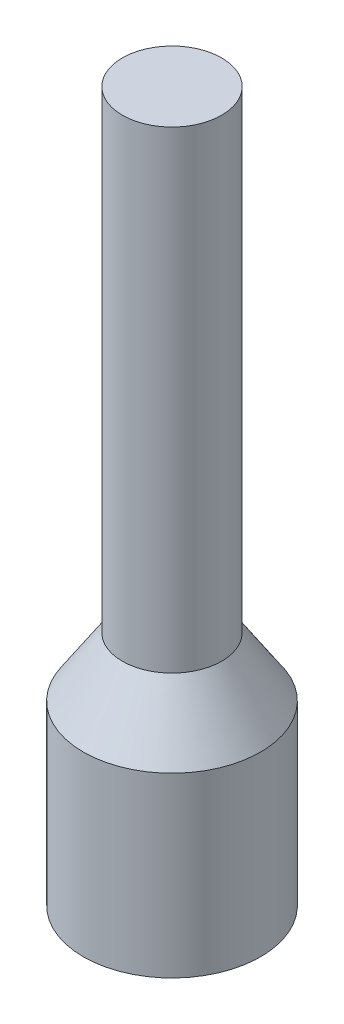
ISO-10303-21;
HEADER;
FILE_DESCRIPTION(('STEP AP214'),'2;1');
FILE_NAME('part.step','',(''),(''),'','','');
FILE_SCHEMA(('AUTOMOTIVE_DESIGN { 1 0 10303 214 1 1 1 1 }'));
ENDSEC;
DATA;
#1=APPLICATION_CONTEXT('core data for automotive mechanical design processes');
#2=APPLICATION_PROTOCOL_DEFINITION('international standard','automotive_design',2000,#1);
#3=PRODUCT_CONTEXT('',#1,'mechanical');
#4=PRODUCT('Part','Part','',(#3));
#5=PRODUCT_RELATED_PRODUCT_CATEGORY('part','',(#4));
#6=PRODUCT_DEFINITION_FORMATION('','',#4);
#7=PRODUCT_DEFINITION_CONTEXT('part definition',#1,'design');
#8=PRODUCT_DEFINITION('design','',#6,#7);
#9=PRODUCT_DEFINITION_SHAPE('','',#8);
#10=(LENGTH_UNIT() NAMED_UNIT(*) SI_UNIT(.MILLI.,.METRE.));
#11=(NAMED_UNIT(*) PLANE_ANGLE_UNIT() SI_UNIT($,.RADIAN.));
#12=(NAMED_UNIT(*) SI_UNIT($,.STERADIAN.) SOLID_ANGLE_UNIT());
#13=UNCERTAINTY_MEASURE_WITH_UNIT(LENGTH_MEASURE(1.E-05),#10,'distance_accuracy_value','');
#14=(GEOMETRIC_REPRESENTATION_CONTEXT(3) GLOBAL_UNCERTAINTY_ASSIGNED_CONTEXT((#13)) GLOBAL_UNIT_ASSIGNED_CONTEXT((#10,
#11,#12)) REPRESENTATION_CONTEXT('',''));
#15=CARTESIAN_POINT('',(0.,0.,0.));
#16=DIRECTION('',(0.,0.,1.));
#17=DIRECTION('',(1.,0.,0.));
#18=AXIS2_PLACEMENT_3D('',#15,#16,#17);
#19=CARTESIAN_POINT('',(0.,0.,0.));
#20=DIRECTION('',(0.,1.,0.));
#21=DIRECTION('',(0.,0.,1.));
#22=AXIS2_PLACEMENT_3D('',#19,#20,#21);
#23=PLANE('',#22);
#24=CARTESIAN_POINT('',(0.,0.,0.));
#25=DIRECTION('',(0.,1.,0.));
#26=DIRECTION('',(0.,0.,1.));
#27=AXIS2_PLACEMENT_3D('',#24,#25,#26);
#28=CIRCLE('',#27,37.5);
#29=CARTESIAN_POINT('',(0.,0.,37.5));
#30=VERTEX_POINT('',#29);
#31=EDGE_CURVE('E10',#30,#30,#28,.T.);
#32=ORIENTED_EDGE('',*,*,#31,.F.);
#33=EDGE_LOOP('',(#32));
#34=FACE_BOUND('',#33,.T.);
#35=ADVANCED_FACE('F34',(#34),#23,.F.);
#36=CARTESIAN_POINT('',(0.,334.417519895622,0.));
#37=DIRECTION('',(0.,1.,0.));
#38=DIRECTION('',(0.,0.,1.));
#39=AXIS2_PLACEMENT_3D('',#36,#37,#38);
#40=CYLINDRICAL_SURFACE('',#39,37.5);
#41=CARTESIAN_POINT('',(0.,75.,0.));
#42=DIRECTION('',(0.,1.,0.));
#43=DIRECTION('',(0.,0.,1.));
#44=AXIS2_PLACEMENT_3D('',#41,#42,#43);
#45=CIRCLE('',#44,37.5);
#46=CARTESIAN_POINT('',(0.,75.,37.5));
#47=VERTEX_POINT('',#46);
#48=EDGE_CURVE('E40',#47,#47,#45,.T.);
#49=ORIENTED_EDGE('',*,*,#48,.F.);
#50=EDGE_LOOP('',(#49));
#51=FACE_BOUND('',#50,.T.);
#52=ORIENTED_EDGE('',*,*,#31,.T.);
#53=EDGE_LOOP('',(#52));
#54=FACE_BOUND('',#53,.T.);
#55=ADVANCED_FACE('F64',(#51,#54),#40,.T.);
#56=CARTESIAN_POINT('',(0.,75.,0.));
#57=DIRECTION('',(0.,-1.,0.));
#58=DIRECTION('',(0.,0.,-1.));
#59=AXIS2_PLACEMENT_3D('',#56,#57,#58);
#60=CONICAL_SURFACE('',#59,37.5,0.583373006993856);
#61=CARTESIAN_POINT('',(0.,100.,0.));
#62=DIRECTION('',(0.,1.,0.));
#63=DIRECTION('',(0.,0.,1.));
#64=AXIS2_PLACEMENT_3D('',#61,#62,#63);
#65=CIRCLE('',#64,21.);
#66=CARTESIAN_POINT('',(0.,100.,21.));
#67=VERTEX_POINT('',#66);
#68=EDGE_CURVE('E44',#67,#67,#65,.T.);
#69=ORIENTED_EDGE('',*,*,#68,.F.);
#70=EDGE_LOOP('',(#69));
#71=FACE_BOUND('',#70,.T.);
#72=ORIENTED_EDGE('',*,*,#48,.T.);
#73=EDGE_LOOP('',(#72));
#74=FACE_BOUND('',#73,.T.);
#75=ADVANCED_FACE('F59',(#71,#74),#60,.T.);
#76=CARTESIAN_POINT('',(0.,334.417519895622,0.));
#77=DIRECTION('',(0.,1.,0.));
#78=DIRECTION('',(0.,0.,1.));
#79=AXIS2_PLACEMENT_3D('',#76,#77,#78);
#80=CYLINDRICAL_SURFACE('',#79,21.);
#81=CARTESIAN_POINT('',(0.,300.,0.));
#82=DIRECTION('',(0.,1.,0.));
#83=DIRECTION('',(0.,0.,1.));
#84=AXIS2_PLACEMENT_3D('',#81,#82,#83);
#85=CIRCLE('',#84,21.);
#86=CARTESIAN_POINT('',(0.,300.,21.));
#87=VERTEX_POINT('',#86);
#88=EDGE_CURVE('E48',#87,#87,#85,.T.);
#89=ORIENTED_EDGE('',*,*,#88,.F.);
#90=EDGE_LOOP('',(#89));
#91=FACE_BOUND('',#90,.T.);
#92=ORIENTED_EDGE('',*,*,#68,.T.);
#93=EDGE_LOOP('',(#92));
#94=FACE_BOUND('',#93,.T.);
#95=ADVANCED_FACE('F56',(#91,#94),#80,.T.);
#96=CARTESIAN_POINT('',(21.,300.,0.));
#97=DIRECTION('',(0.,-1.,0.));
#98=DIRECTION('',(0.,0.,-1.));
#99=AXIS2_PLACEMENT_3D('',#96,#97,#98);
#100=PLANE('',#99);
#101=ORIENTED_EDGE('',*,*,#88,.T.);
#102=EDGE_LOOP('',(#101));
#103=FACE_BOUND('',#102,.T.);
#104=ADVANCED_FACE('F54',(#103),#100,.F.);
#105=CLOSED_SHELL('',(#35,#55,#75,#95,#104));
#106=MANIFOLD_SOLID_BREP('B2',#105);
#107=ADVANCED_BREP_SHAPE_REPRESENTATION('',(#18,#106),#14);
#108=SHAPE_DEFINITION_REPRESENTATION(#9,#107);
ENDSEC;
END-ISO-10303-21;
